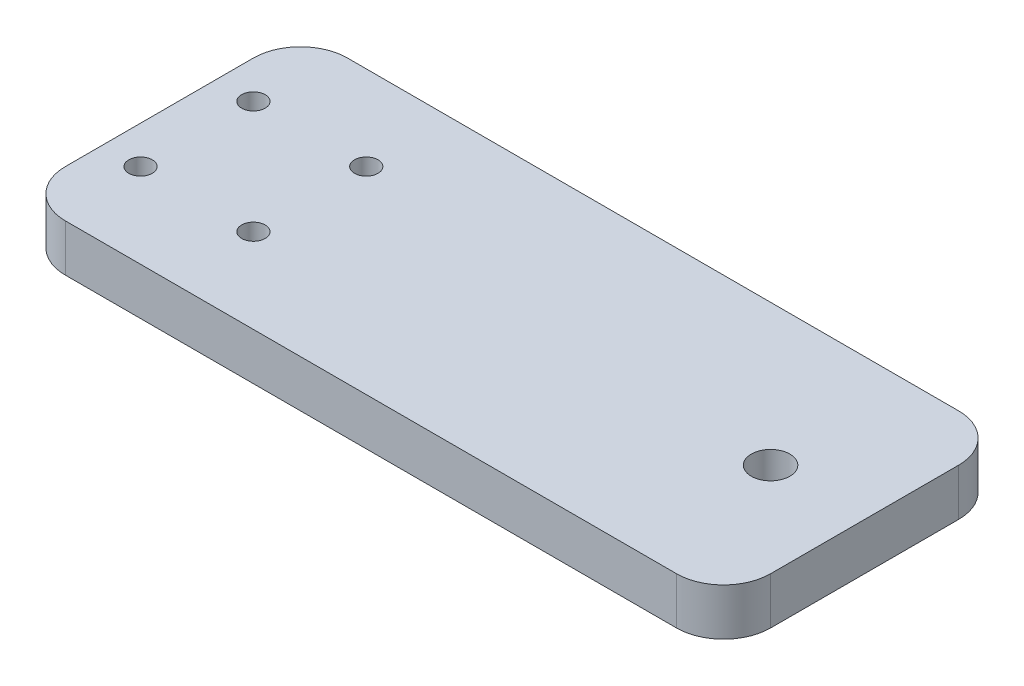
ISO-10303-21;
HEADER;
FILE_DESCRIPTION(('STEP AP214'),'2;1');
FILE_NAME('part.step','',(''),(''),'','','');
FILE_SCHEMA(('AUTOMOTIVE_DESIGN { 1 0 10303 214 1 1 1 1 }'));
ENDSEC;
DATA;
#1=APPLICATION_CONTEXT('core data for automotive mechanical design processes');
#2=APPLICATION_PROTOCOL_DEFINITION('international standard','automotive_design',2000,#1);
#3=PRODUCT_CONTEXT('',#1,'mechanical');
#4=PRODUCT('Part','Part','',(#3));
#5=PRODUCT_RELATED_PRODUCT_CATEGORY('part','',(#4));
#6=PRODUCT_DEFINITION_FORMATION('','',#4);
#7=PRODUCT_DEFINITION_CONTEXT('part definition',#1,'design');
#8=PRODUCT_DEFINITION('design','',#6,#7);
#9=PRODUCT_DEFINITION_SHAPE('','',#8);
#10=(LENGTH_UNIT() NAMED_UNIT(*) SI_UNIT(.MILLI.,.METRE.));
#11=(NAMED_UNIT(*) PLANE_ANGLE_UNIT() SI_UNIT($,.RADIAN.));
#12=(NAMED_UNIT(*) SI_UNIT($,.STERADIAN.) SOLID_ANGLE_UNIT());
#13=UNCERTAINTY_MEASURE_WITH_UNIT(LENGTH_MEASURE(1.E-05),#10,'distance_accuracy_value','');
#14=(GEOMETRIC_REPRESENTATION_CONTEXT(3) GLOBAL_UNCERTAINTY_ASSIGNED_CONTEXT((#13)) GLOBAL_UNIT_ASSIGNED_CONTEXT((#10,
#11,#12)) REPRESENTATION_CONTEXT('',''));
#15=CARTESIAN_POINT('',(0.,0.,0.));
#16=DIRECTION('',(0.,0.,1.));
#17=DIRECTION('',(1.,0.,0.));
#18=AXIS2_PLACEMENT_3D('',#15,#16,#17);
#19=CARTESIAN_POINT('',(75.,10.,30.));
#20=DIRECTION('',(-1.,0.,0.));
#21=DIRECTION('',(0.,0.,1.));
#22=AXIS2_PLACEMENT_3D('',#19,#20,#21);
#23=PLANE('',#22);
#24=DIRECTION('',(0.,0.,-1.));
#25=VECTOR('',#24,1.);
#26=CARTESIAN_POINT('',(75.,0.,30.));
#27=LINE('',#26,#25);
#28=CARTESIAN_POINT('',(75.,0.,20.));
#29=VERTEX_POINT('',#28);
#30=CARTESIAN_POINT('',(75.,0.,-20.));
#31=VERTEX_POINT('',#30);
#32=EDGE_CURVE('E128',#29,#31,#27,.T.);
#33=ORIENTED_EDGE('',*,*,#32,.T.);
#34=DIRECTION('',(0.,-1.,0.));
#35=VECTOR('',#34,1.);
#36=CARTESIAN_POINT('',(75.,10.,-20.));
#37=LINE('',#36,#35);
#38=CARTESIAN_POINT('',(75.,10.,-20.));
#39=VERTEX_POINT('',#38);
#40=EDGE_CURVE('E151',#31,#39,#37,.F.);
#41=ORIENTED_EDGE('',*,*,#40,.T.);
#42=DIRECTION('',(0.,0.,-1.));
#43=VECTOR('',#42,1.);
#44=CARTESIAN_POINT('',(75.,10.,30.));
#45=LINE('',#44,#43);
#46=CARTESIAN_POINT('',(75.,10.,20.));
#47=VERTEX_POINT('',#46);
#48=EDGE_CURVE('E126',#47,#39,#45,.T.);
#49=ORIENTED_EDGE('',*,*,#48,.F.);
#50=DIRECTION('',(0.,-1.,0.));
#51=VECTOR('',#50,1.);
#52=CARTESIAN_POINT('',(75.,10.,20.));
#53=LINE('',#52,#51);
#54=EDGE_CURVE('E148',#47,#29,#53,.T.);
#55=ORIENTED_EDGE('',*,*,#54,.T.);
#56=EDGE_LOOP('',(#33,#41,#49,#55));
#57=FACE_BOUND('',#56,.T.);
#58=ADVANCED_FACE('F33',(#57),#23,.F.);
#59=CARTESIAN_POINT('',(-75.,10.,-30.));
#60=DIRECTION('',(0.,0.,1.));
#61=DIRECTION('',(1.,0.,0.));
#62=AXIS2_PLACEMENT_3D('',#59,#60,#61);
#63=PLANE('',#62);
#64=DIRECTION('',(-1.,0.,0.));
#65=VECTOR('',#64,1.);
#66=CARTESIAN_POINT('',(-75.,0.,-30.));
#67=LINE('',#66,#65);
#68=CARTESIAN_POINT('',(65.,0.,-30.));
#69=VERTEX_POINT('',#68);
#70=CARTESIAN_POINT('',(-65.,0.,-30.));
#71=VERTEX_POINT('',#70);
#72=EDGE_CURVE('E124',#69,#71,#67,.T.);
#73=ORIENTED_EDGE('',*,*,#72,.T.);
#74=DIRECTION('',(0.,-1.,0.));
#75=VECTOR('',#74,1.);
#76=CARTESIAN_POINT('',(-65.,10.,-30.));
#77=LINE('',#76,#75);
#78=CARTESIAN_POINT('',(-65.,10.,-30.));
#79=VERTEX_POINT('',#78);
#80=EDGE_CURVE('E103',#71,#79,#77,.F.);
#81=ORIENTED_EDGE('',*,*,#80,.T.);
#82=DIRECTION('',(-1.,0.,0.));
#83=VECTOR('',#82,1.);
#84=CARTESIAN_POINT('',(-75.,10.,-30.));
#85=LINE('',#84,#83);
#86=CARTESIAN_POINT('',(65.,10.,-30.));
#87=VERTEX_POINT('',#86);
#88=EDGE_CURVE('E167',#87,#79,#85,.T.);
#89=ORIENTED_EDGE('',*,*,#88,.F.);
#90=DIRECTION('',(0.,-1.,0.));
#91=VECTOR('',#90,1.);
#92=CARTESIAN_POINT('',(65.,10.,-30.));
#93=LINE('',#92,#91);
#94=EDGE_CURVE('E108',#87,#69,#93,.T.);
#95=ORIENTED_EDGE('',*,*,#94,.T.);
#96=EDGE_LOOP('',(#73,#81,#89,#95));
#97=FACE_BOUND('',#96,.T.);
#98=ADVANCED_FACE('F228',(#97),#63,.F.);
#99=CARTESIAN_POINT('',(-75.,10.,30.));
#100=DIRECTION('',(1.,0.,0.));
#101=DIRECTION('',(0.,0.,-1.));
#102=AXIS2_PLACEMENT_3D('',#99,#100,#101);
#103=PLANE('',#102);
#104=DIRECTION('',(0.,0.,1.));
#105=VECTOR('',#104,1.);
#106=CARTESIAN_POINT('',(-75.,10.,30.));
#107=LINE('',#106,#105);
#108=CARTESIAN_POINT('',(-75.,10.,-20.));
#109=VERTEX_POINT('',#108);
#110=CARTESIAN_POINT('',(-75.,10.,20.));
#111=VERTEX_POINT('',#110);
#112=EDGE_CURVE('E117',#109,#111,#107,.T.);
#113=ORIENTED_EDGE('',*,*,#112,.F.);
#114=DIRECTION('',(0.,-1.,0.));
#115=VECTOR('',#114,1.);
#116=CARTESIAN_POINT('',(-75.,10.,-20.));
#117=LINE('',#116,#115);
#118=CARTESIAN_POINT('',(-75.,0.,-20.));
#119=VERTEX_POINT('',#118);
#120=EDGE_CURVE('E102',#109,#119,#117,.T.);
#121=ORIENTED_EDGE('',*,*,#120,.T.);
#122=DIRECTION('',(0.,0.,1.));
#123=VECTOR('',#122,1.);
#124=CARTESIAN_POINT('',(-75.,0.,30.));
#125=LINE('',#124,#123);
#126=CARTESIAN_POINT('',(-75.,0.,20.));
#127=VERTEX_POINT('',#126);
#128=EDGE_CURVE('E115',#119,#127,#125,.T.);
#129=ORIENTED_EDGE('',*,*,#128,.T.);
#130=DIRECTION('',(0.,-1.,0.));
#131=VECTOR('',#130,1.);
#132=CARTESIAN_POINT('',(-75.,10.,20.));
#133=LINE('',#132,#131);
#134=EDGE_CURVE('E119',#127,#111,#133,.F.);
#135=ORIENTED_EDGE('',*,*,#134,.T.);
#136=EDGE_LOOP('',(#113,#121,#129,#135));
#137=FACE_BOUND('',#136,.T.);
#138=ADVANCED_FACE('F114',(#137),#103,.F.);
#139=CARTESIAN_POINT('',(-75.,10.,30.));
#140=DIRECTION('',(0.,0.,-1.));
#141=DIRECTION('',(-1.,0.,0.));
#142=AXIS2_PLACEMENT_3D('',#139,#140,#141);
#143=PLANE('',#142);
#144=DIRECTION('',(1.,0.,0.));
#145=VECTOR('',#144,1.);
#146=CARTESIAN_POINT('',(-75.,0.,30.));
#147=LINE('',#146,#145);
#148=CARTESIAN_POINT('',(-65.,0.,30.));
#149=VERTEX_POINT('',#148);
#150=CARTESIAN_POINT('',(65.,0.,30.));
#151=VERTEX_POINT('',#150);
#152=EDGE_CURVE('E123',#149,#151,#147,.T.);
#153=ORIENTED_EDGE('',*,*,#152,.T.);
#154=DIRECTION('',(0.,-1.,0.));
#155=VECTOR('',#154,1.);
#156=CARTESIAN_POINT('',(65.,10.,30.));
#157=LINE('',#156,#155);
#158=CARTESIAN_POINT('',(65.,10.,30.));
#159=VERTEX_POINT('',#158);
#160=EDGE_CURVE('E11',#151,#159,#157,.F.);
#161=ORIENTED_EDGE('',*,*,#160,.T.);
#162=DIRECTION('',(1.,0.,0.));
#163=VECTOR('',#162,1.);
#164=CARTESIAN_POINT('',(-75.,10.,30.));
#165=LINE('',#164,#163);
#166=CARTESIAN_POINT('',(-65.,10.,30.));
#167=VERTEX_POINT('',#166);
#168=EDGE_CURVE('E132',#167,#159,#165,.T.);
#169=ORIENTED_EDGE('',*,*,#168,.F.);
#170=DIRECTION('',(0.,-1.,0.));
#171=VECTOR('',#170,1.);
#172=CARTESIAN_POINT('',(-65.,10.,30.));
#173=LINE('',#172,#171);
#174=EDGE_CURVE('E41',#167,#149,#173,.T.);
#175=ORIENTED_EDGE('',*,*,#174,.T.);
#176=EDGE_LOOP('',(#153,#161,#169,#175));
#177=FACE_BOUND('',#176,.T.);
#178=ADVANCED_FACE('F154',(#177),#143,.F.);
#179=CARTESIAN_POINT('',(0.,10.,0.));
#180=DIRECTION('',(0.,-1.,0.));
#181=DIRECTION('',(0.,0.,-1.));
#182=AXIS2_PLACEMENT_3D('',#179,#180,#181);
#183=PLANE('',#182);
#184=CARTESIAN_POINT('',(-43.,10.,-12.));
#185=DIRECTION('',(0.,1.,0.));
#186=DIRECTION('',(0.,0.,1.));
#187=AXIS2_PLACEMENT_3D('',#184,#185,#186);
#188=CIRCLE('',#187,2.5);
#189=CARTESIAN_POINT('',(-43.,10.,-9.5));
#190=VERTEX_POINT('',#189);
#191=EDGE_CURVE('E190',#190,#190,#188,.T.);
#192=ORIENTED_EDGE('',*,*,#191,.F.);
#193=EDGE_LOOP('',(#192));
#194=FACE_BOUND('',#193,.T.);
#195=CARTESIAN_POINT('',(-67.,10.,12.));
#196=DIRECTION('',(0.,1.,0.));
#197=DIRECTION('',(0.,0.,1.));
#198=AXIS2_PLACEMENT_3D('',#195,#196,#197);
#199=CIRCLE('',#198,2.49999999999999);
#200=CARTESIAN_POINT('',(-67.,10.,14.5));
#201=VERTEX_POINT('',#200);
#202=EDGE_CURVE('E183',#201,#201,#199,.T.);
#203=ORIENTED_EDGE('',*,*,#202,.F.);
#204=EDGE_LOOP('',(#203));
#205=FACE_BOUND('',#204,.T.);
#206=CARTESIAN_POINT('',(-43.,10.,12.));
#207=DIRECTION('',(0.,1.,0.));
#208=DIRECTION('',(0.,0.,1.));
#209=AXIS2_PLACEMENT_3D('',#206,#207,#208);
#210=CIRCLE('',#209,2.5);
#211=CARTESIAN_POINT('',(-43.,10.,14.5));
#212=VERTEX_POINT('',#211);
#213=EDGE_CURVE('E201',#212,#212,#210,.T.);
#214=ORIENTED_EDGE('',*,*,#213,.F.);
#215=EDGE_LOOP('',(#214));
#216=FACE_BOUND('',#215,.T.);
#217=CARTESIAN_POINT('',(55.,10.,0.));
#218=DIRECTION('',(0.,1.,0.));
#219=DIRECTION('',(0.,0.,1.));
#220=AXIS2_PLACEMENT_3D('',#217,#218,#219);
#221=CIRCLE('',#220,4.1);
#222=CARTESIAN_POINT('',(55.,10.,4.1));
#223=VERTEX_POINT('',#222);
#224=EDGE_CURVE('E195',#223,#223,#221,.T.);
#225=ORIENTED_EDGE('',*,*,#224,.F.);
#226=EDGE_LOOP('',(#225));
#227=FACE_BOUND('',#226,.T.);
#228=CARTESIAN_POINT('',(-67.,10.,-12.));
#229=DIRECTION('',(0.,1.,0.));
#230=DIRECTION('',(0.,0.,1.));
#231=AXIS2_PLACEMENT_3D('',#228,#229,#230);
#232=CIRCLE('',#231,2.49999999999999);
#233=CARTESIAN_POINT('',(-67.,10.,-9.50000000000001));
#234=VERTEX_POINT('',#233);
#235=EDGE_CURVE('E172',#234,#234,#232,.T.);
#236=ORIENTED_EDGE('',*,*,#235,.F.);
#237=EDGE_LOOP('',(#236));
#238=FACE_BOUND('',#237,.T.);
#239=ORIENTED_EDGE('',*,*,#88,.T.);
#240=CARTESIAN_POINT('',(-65.,10.,-20.));
#241=DIRECTION('',(0.,-1.,0.));
#242=DIRECTION('',(0.,0.,-1.));
#243=AXIS2_PLACEMENT_3D('',#240,#241,#242);
#244=CIRCLE('',#243,10.);
#245=EDGE_CURVE('E146',#79,#109,#244,.F.);
#246=ORIENTED_EDGE('',*,*,#245,.T.);
#247=ORIENTED_EDGE('',*,*,#112,.T.);
#248=CARTESIAN_POINT('',(-65.,10.,20.));
#249=DIRECTION('',(0.,-1.,0.));
#250=DIRECTION('',(0.,0.,-1.));
#251=AXIS2_PLACEMENT_3D('',#248,#249,#250);
#252=CIRCLE('',#251,10.);
#253=EDGE_CURVE('E53',#111,#167,#252,.F.);
#254=ORIENTED_EDGE('',*,*,#253,.T.);
#255=ORIENTED_EDGE('',*,*,#168,.T.);
#256=CARTESIAN_POINT('',(65.,10.,20.));
#257=DIRECTION('',(0.,-1.,0.));
#258=DIRECTION('',(0.,0.,-1.));
#259=AXIS2_PLACEMENT_3D('',#256,#257,#258);
#260=CIRCLE('',#259,10.);
#261=EDGE_CURVE('E142',#159,#47,#260,.F.);
#262=ORIENTED_EDGE('',*,*,#261,.T.);
#263=ORIENTED_EDGE('',*,*,#48,.T.);
#264=CARTESIAN_POINT('',(65.,10.,-20.));
#265=DIRECTION('',(0.,-1.,0.));
#266=DIRECTION('',(0.,0.,-1.));
#267=AXIS2_PLACEMENT_3D('',#264,#265,#266);
#268=CIRCLE('',#267,10.);
#269=EDGE_CURVE('E144',#39,#87,#268,.F.);
#270=ORIENTED_EDGE('',*,*,#269,.T.);
#271=EDGE_LOOP('',(#239,#246,#247,#254,#255,#262,#263,#270));
#272=FACE_BOUND('',#271,.T.);
#273=ADVANCED_FACE('F217',(#194,#205,#216,#227,#238,#272),#183,.F.);
#274=CARTESIAN_POINT('',(0.,0.,0.));
#275=DIRECTION('',(0.,-1.,0.));
#276=DIRECTION('',(0.,0.,-1.));
#277=AXIS2_PLACEMENT_3D('',#274,#275,#276);
#278=PLANE('',#277);
#279=CARTESIAN_POINT('',(-43.,0.,-12.));
#280=DIRECTION('',(0.,1.,0.));
#281=DIRECTION('',(0.,0.,1.));
#282=AXIS2_PLACEMENT_3D('',#279,#280,#281);
#283=CIRCLE('',#282,2.5);
#284=CARTESIAN_POINT('',(-43.,0.,-9.5));
#285=VERTEX_POINT('',#284);
#286=EDGE_CURVE('E181',#285,#285,#283,.T.);
#287=ORIENTED_EDGE('',*,*,#286,.T.);
#288=EDGE_LOOP('',(#287));
#289=FACE_BOUND('',#288,.T.);
#290=CARTESIAN_POINT('',(-67.,0.,12.));
#291=DIRECTION('',(0.,1.,0.));
#292=DIRECTION('',(0.,0.,1.));
#293=AXIS2_PLACEMENT_3D('',#290,#291,#292);
#294=CIRCLE('',#293,2.49999999999999);
#295=CARTESIAN_POINT('',(-67.,0.,14.5));
#296=VERTEX_POINT('',#295);
#297=EDGE_CURVE('E186',#296,#296,#294,.T.);
#298=ORIENTED_EDGE('',*,*,#297,.T.);
#299=EDGE_LOOP('',(#298));
#300=FACE_BOUND('',#299,.T.);
#301=CARTESIAN_POINT('',(-43.,0.,12.));
#302=DIRECTION('',(0.,1.,0.));
#303=DIRECTION('',(0.,0.,1.));
#304=AXIS2_PLACEMENT_3D('',#301,#302,#303);
#305=CIRCLE('',#304,2.5);
#306=CARTESIAN_POINT('',(-43.,0.,14.5));
#307=VERTEX_POINT('',#306);
#308=EDGE_CURVE('E187',#307,#307,#305,.T.);
#309=ORIENTED_EDGE('',*,*,#308,.T.);
#310=EDGE_LOOP('',(#309));
#311=FACE_BOUND('',#310,.T.);
#312=CARTESIAN_POINT('',(55.,0.,0.));
#313=DIRECTION('',(0.,1.,0.));
#314=DIRECTION('',(0.,0.,1.));
#315=AXIS2_PLACEMENT_3D('',#312,#313,#314);
#316=CIRCLE('',#315,4.1);
#317=CARTESIAN_POINT('',(55.,0.,4.1));
#318=VERTEX_POINT('',#317);
#319=EDGE_CURVE('E198',#318,#318,#316,.T.);
#320=ORIENTED_EDGE('',*,*,#319,.T.);
#321=EDGE_LOOP('',(#320));
#322=FACE_BOUND('',#321,.T.);
#323=CARTESIAN_POINT('',(-67.,0.,-12.));
#324=DIRECTION('',(0.,1.,0.));
#325=DIRECTION('',(0.,0.,1.));
#326=AXIS2_PLACEMENT_3D('',#323,#324,#325);
#327=CIRCLE('',#326,2.49999999999999);
#328=CARTESIAN_POINT('',(-67.,0.,-9.50000000000001));
#329=VERTEX_POINT('',#328);
#330=EDGE_CURVE('E176',#329,#329,#327,.T.);
#331=ORIENTED_EDGE('',*,*,#330,.T.);
#332=EDGE_LOOP('',(#331));
#333=FACE_BOUND('',#332,.T.);
#334=ORIENTED_EDGE('',*,*,#128,.F.);
#335=CARTESIAN_POINT('',(-65.,0.,-20.));
#336=DIRECTION('',(0.,-1.,0.));
#337=DIRECTION('',(0.,0.,-1.));
#338=AXIS2_PLACEMENT_3D('',#335,#336,#337);
#339=CIRCLE('',#338,10.);
#340=EDGE_CURVE('E98',#119,#71,#339,.T.);
#341=ORIENTED_EDGE('',*,*,#340,.T.);
#342=ORIENTED_EDGE('',*,*,#72,.F.);
#343=CARTESIAN_POINT('',(65.,0.,-20.));
#344=DIRECTION('',(0.,-1.,0.));
#345=DIRECTION('',(0.,0.,-1.));
#346=AXIS2_PLACEMENT_3D('',#343,#344,#345);
#347=CIRCLE('',#346,10.);
#348=EDGE_CURVE('E109',#69,#31,#347,.T.);
#349=ORIENTED_EDGE('',*,*,#348,.T.);
#350=ORIENTED_EDGE('',*,*,#32,.F.);
#351=CARTESIAN_POINT('',(65.,0.,20.));
#352=DIRECTION('',(0.,-1.,0.));
#353=DIRECTION('',(0.,0.,-1.));
#354=AXIS2_PLACEMENT_3D('',#351,#352,#353);
#355=CIRCLE('',#354,10.);
#356=EDGE_CURVE('E135',#29,#151,#355,.T.);
#357=ORIENTED_EDGE('',*,*,#356,.T.);
#358=ORIENTED_EDGE('',*,*,#152,.F.);
#359=CARTESIAN_POINT('',(-65.,0.,20.));
#360=DIRECTION('',(0.,-1.,0.));
#361=DIRECTION('',(0.,0.,-1.));
#362=AXIS2_PLACEMENT_3D('',#359,#360,#361);
#363=CIRCLE('',#362,10.);
#364=EDGE_CURVE('E118',#149,#127,#363,.T.);
#365=ORIENTED_EDGE('',*,*,#364,.T.);
#366=EDGE_LOOP('',(#334,#341,#342,#349,#350,#357,#358,#365));
#367=FACE_BOUND('',#366,.T.);
#368=ADVANCED_FACE('F121',(#289,#300,#311,#322,#333,#367),#278,.T.);
#369=CARTESIAN_POINT('',(-65.,10.,-20.));
#370=DIRECTION('',(0.,-1.,0.));
#371=DIRECTION('',(0.,0.,-1.));
#372=AXIS2_PLACEMENT_3D('',#369,#370,#371);
#373=CYLINDRICAL_SURFACE('',#372,10.);
#374=ORIENTED_EDGE('',*,*,#245,.F.);
#375=ORIENTED_EDGE('',*,*,#80,.F.);
#376=ORIENTED_EDGE('',*,*,#340,.F.);
#377=ORIENTED_EDGE('',*,*,#120,.F.);
#378=EDGE_LOOP('',(#374,#375,#376,#377));
#379=FACE_BOUND('',#378,.T.);
#380=ADVANCED_FACE('F101',(#379),#373,.T.);
#381=CARTESIAN_POINT('',(65.,10.,-20.));
#382=DIRECTION('',(0.,-1.,0.));
#383=DIRECTION('',(0.,0.,-1.));
#384=AXIS2_PLACEMENT_3D('',#381,#382,#383);
#385=CYLINDRICAL_SURFACE('',#384,10.);
#386=ORIENTED_EDGE('',*,*,#269,.F.);
#387=ORIENTED_EDGE('',*,*,#40,.F.);
#388=ORIENTED_EDGE('',*,*,#348,.F.);
#389=ORIENTED_EDGE('',*,*,#94,.F.);
#390=EDGE_LOOP('',(#386,#387,#388,#389));
#391=FACE_BOUND('',#390,.T.);
#392=ADVANCED_FACE('F230',(#391),#385,.T.);
#393=CARTESIAN_POINT('',(65.,10.,20.));
#394=DIRECTION('',(0.,-1.,0.));
#395=DIRECTION('',(0.,0.,-1.));
#396=AXIS2_PLACEMENT_3D('',#393,#394,#395);
#397=CYLINDRICAL_SURFACE('',#396,10.);
#398=ORIENTED_EDGE('',*,*,#261,.F.);
#399=ORIENTED_EDGE('',*,*,#160,.F.);
#400=ORIENTED_EDGE('',*,*,#356,.F.);
#401=ORIENTED_EDGE('',*,*,#54,.F.);
#402=EDGE_LOOP('',(#398,#399,#400,#401));
#403=FACE_BOUND('',#402,.T.);
#404=ADVANCED_FACE('F161',(#403),#397,.T.);
#405=CARTESIAN_POINT('',(-65.,10.,20.));
#406=DIRECTION('',(0.,-1.,0.));
#407=DIRECTION('',(0.,0.,-1.));
#408=AXIS2_PLACEMENT_3D('',#405,#406,#407);
#409=CYLINDRICAL_SURFACE('',#408,10.);
#410=ORIENTED_EDGE('',*,*,#253,.F.);
#411=ORIENTED_EDGE('',*,*,#134,.F.);
#412=ORIENTED_EDGE('',*,*,#364,.F.);
#413=ORIENTED_EDGE('',*,*,#174,.F.);
#414=EDGE_LOOP('',(#410,#411,#412,#413));
#415=FACE_BOUND('',#414,.T.);
#416=ADVANCED_FACE('F35',(#415),#409,.T.);
#417=CARTESIAN_POINT('',(-67.,0.,-12.));
#418=DIRECTION('',(0.,1.,0.));
#419=DIRECTION('',(0.,0.,1.));
#420=AXIS2_PLACEMENT_3D('',#417,#418,#419);
#421=CYLINDRICAL_SURFACE('',#420,2.49999999999999);
#422=ORIENTED_EDGE('',*,*,#330,.F.);
#423=EDGE_LOOP('',(#422));
#424=FACE_BOUND('',#423,.T.);
#425=ORIENTED_EDGE('',*,*,#235,.T.);
#426=EDGE_LOOP('',(#425));
#427=FACE_BOUND('',#426,.T.);
#428=ADVANCED_FACE('F252',(#424,#427),#421,.F.);
#429=CARTESIAN_POINT('',(55.,0.,0.));
#430=DIRECTION('',(0.,1.,0.));
#431=DIRECTION('',(0.,0.,1.));
#432=AXIS2_PLACEMENT_3D('',#429,#430,#431);
#433=CYLINDRICAL_SURFACE('',#432,4.1);
#434=ORIENTED_EDGE('',*,*,#319,.F.);
#435=EDGE_LOOP('',(#434));
#436=FACE_BOUND('',#435,.T.);
#437=ORIENTED_EDGE('',*,*,#224,.T.);
#438=EDGE_LOOP('',(#437));
#439=FACE_BOUND('',#438,.T.);
#440=ADVANCED_FACE('F213',(#436,#439),#433,.F.);
#441=CARTESIAN_POINT('',(-43.,0.,12.));
#442=DIRECTION('',(0.,1.,0.));
#443=DIRECTION('',(0.,0.,1.));
#444=AXIS2_PLACEMENT_3D('',#441,#442,#443);
#445=CYLINDRICAL_SURFACE('',#444,2.5);
#446=ORIENTED_EDGE('',*,*,#308,.F.);
#447=EDGE_LOOP('',(#446));
#448=FACE_BOUND('',#447,.T.);
#449=ORIENTED_EDGE('',*,*,#213,.T.);
#450=EDGE_LOOP('',(#449));
#451=FACE_BOUND('',#450,.T.);
#452=ADVANCED_FACE('F209',(#448,#451),#445,.F.);
#453=CARTESIAN_POINT('',(-67.,0.,12.));
#454=DIRECTION('',(0.,1.,0.));
#455=DIRECTION('',(0.,0.,1.));
#456=AXIS2_PLACEMENT_3D('',#453,#454,#455);
#457=CYLINDRICAL_SURFACE('',#456,2.49999999999999);
#458=ORIENTED_EDGE('',*,*,#297,.F.);
#459=EDGE_LOOP('',(#458));
#460=FACE_BOUND('',#459,.T.);
#461=ORIENTED_EDGE('',*,*,#202,.T.);
#462=EDGE_LOOP('',(#461));
#463=FACE_BOUND('',#462,.T.);
#464=ADVANCED_FACE('F212',(#460,#463),#457,.F.);
#465=CARTESIAN_POINT('',(-43.,0.,-12.));
#466=DIRECTION('',(0.,1.,0.));
#467=DIRECTION('',(0.,0.,1.));
#468=AXIS2_PLACEMENT_3D('',#465,#466,#467);
#469=CYLINDRICAL_SURFACE('',#468,2.5);
#470=ORIENTED_EDGE('',*,*,#286,.F.);
#471=EDGE_LOOP('',(#470));
#472=FACE_BOUND('',#471,.T.);
#473=ORIENTED_EDGE('',*,*,#191,.T.);
#474=EDGE_LOOP('',(#473));
#475=FACE_BOUND('',#474,.T.);
#476=ADVANCED_FACE('F258',(#472,#475),#469,.F.);
#477=CLOSED_SHELL('',(#58,#98,#138,#178,#273,#368,#380,#392,#404,#416,#428,#440,#452,#464,#476));
#478=MANIFOLD_SOLID_BREP('B2',#477);
#479=ADVANCED_BREP_SHAPE_REPRESENTATION('',(#18,#478),#14);
#480=SHAPE_DEFINITION_REPRESENTATION(#9,#479);
ENDSEC;
END-ISO-10303-21;
